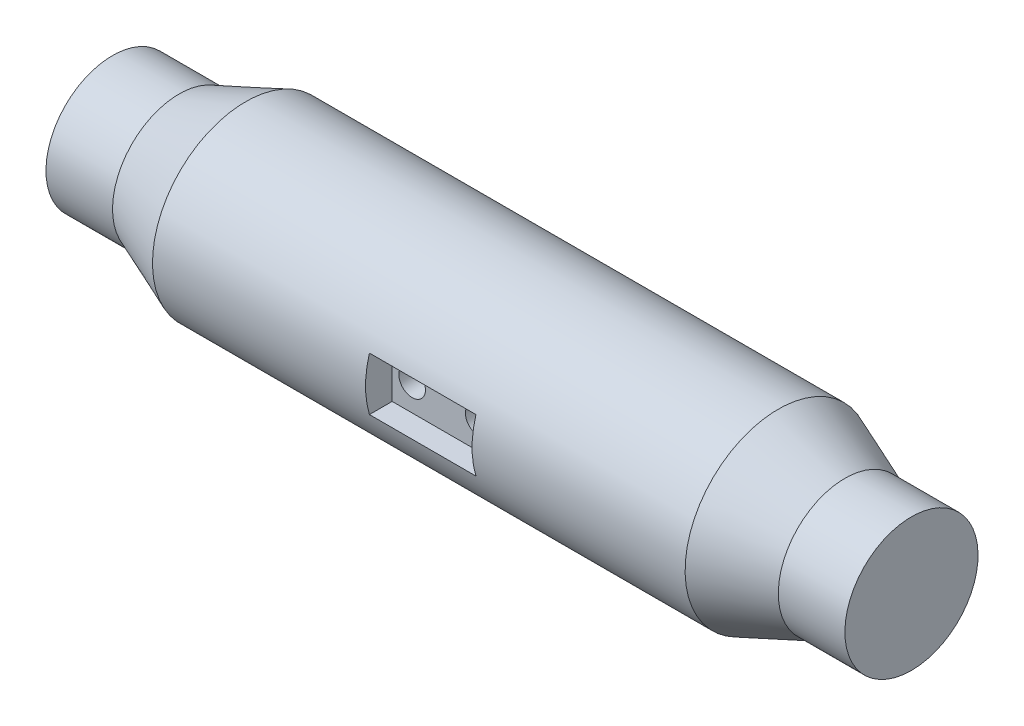
ISO-10303-21;
HEADER;
FILE_DESCRIPTION(('STEP AP214'),'2;1');
FILE_NAME('part.step','',(''),(''),'','','');
FILE_SCHEMA(('AUTOMOTIVE_DESIGN { 1 0 10303 214 1 1 1 1 }'));
ENDSEC;
DATA;
#1=APPLICATION_CONTEXT('core data for automotive mechanical design processes');
#2=APPLICATION_PROTOCOL_DEFINITION('international standard','automotive_design',2000,#1);
#3=PRODUCT_CONTEXT('',#1,'mechanical');
#4=PRODUCT('Part','Part','',(#3));
#5=PRODUCT_RELATED_PRODUCT_CATEGORY('part','',(#4));
#6=PRODUCT_DEFINITION_FORMATION('','',#4);
#7=PRODUCT_DEFINITION_CONTEXT('part definition',#1,'design');
#8=PRODUCT_DEFINITION('design','',#6,#7);
#9=PRODUCT_DEFINITION_SHAPE('','',#8);
#10=(LENGTH_UNIT() NAMED_UNIT(*) SI_UNIT(.MILLI.,.METRE.));
#11=(NAMED_UNIT(*) PLANE_ANGLE_UNIT() SI_UNIT($,.RADIAN.));
#12=(NAMED_UNIT(*) SI_UNIT($,.STERADIAN.) SOLID_ANGLE_UNIT());
#13=UNCERTAINTY_MEASURE_WITH_UNIT(LENGTH_MEASURE(1.E-05),#10,'distance_accuracy_value','');
#14=(GEOMETRIC_REPRESENTATION_CONTEXT(3) GLOBAL_UNCERTAINTY_ASSIGNED_CONTEXT((#13)) GLOBAL_UNIT_ASSIGNED_CONTEXT((#10,
#11,#12)) REPRESENTATION_CONTEXT('',''));
#15=CARTESIAN_POINT('',(0.,0.,0.));
#16=DIRECTION('',(0.,0.,1.));
#17=DIRECTION('',(1.,0.,0.));
#18=AXIS2_PLACEMENT_3D('',#15,#16,#17);
#19=CARTESIAN_POINT('',(30.,0.,0.));
#20=DIRECTION('',(-1.,0.,0.));
#21=DIRECTION('',(0.,-1.,0.));
#22=AXIS2_PLACEMENT_3D('',#19,#20,#21);
#23=PLANE('',#22);
#24=CARTESIAN_POINT('',(30.,0.,0.));
#25=DIRECTION('',(-1.,0.,0.));
#26=DIRECTION('',(0.,-1.,0.));
#27=AXIS2_PLACEMENT_3D('',#24,#25,#26);
#28=CIRCLE('',#27,5.);
#29=CARTESIAN_POINT('',(30.,-5.,0.));
#30=VERTEX_POINT('',#29);
#31=EDGE_CURVE('E124',#30,#30,#28,.T.);
#32=ORIENTED_EDGE('',*,*,#31,.F.);
#33=EDGE_LOOP('',(#32));
#34=FACE_BOUND('',#33,.T.);
#35=ADVANCED_FACE('F33',(#34),#23,.F.);
#36=CARTESIAN_POINT('',(-30.,0.,0.));
#37=DIRECTION('',(-1.,0.,0.));
#38=DIRECTION('',(0.,-1.,0.));
#39=AXIS2_PLACEMENT_3D('',#36,#37,#38);
#40=CYLINDRICAL_SURFACE('',#39,5.);
#41=CARTESIAN_POINT('',(25.,0.,0.));
#42=DIRECTION('',(-1.,0.,0.));
#43=DIRECTION('',(0.,-1.,0.));
#44=AXIS2_PLACEMENT_3D('',#41,#42,#43);
#45=CIRCLE('',#44,5.);
#46=CARTESIAN_POINT('',(25.,-5.,0.));
#47=VERTEX_POINT('',#46);
#48=EDGE_CURVE('E121',#47,#47,#45,.T.);
#49=ORIENTED_EDGE('',*,*,#48,.F.);
#50=EDGE_LOOP('',(#49));
#51=FACE_BOUND('',#50,.T.);
#52=ORIENTED_EDGE('',*,*,#31,.T.);
#53=EDGE_LOOP('',(#52));
#54=FACE_BOUND('',#53,.T.);
#55=ADVANCED_FACE('F146',(#51,#54),#40,.T.);
#56=CARTESIAN_POINT('',(25.,0.,0.));
#57=DIRECTION('',(-1.,0.,0.));
#58=DIRECTION('',(0.,-1.,0.));
#59=AXIS2_PLACEMENT_3D('',#56,#57,#58);
#60=CONICAL_SURFACE('',#59,5.,0.380506377112366);
#61=CARTESIAN_POINT('',(20.,0.,0.));
#62=DIRECTION('',(-1.,0.,0.));
#63=DIRECTION('',(0.,-1.,0.));
#64=AXIS2_PLACEMENT_3D('',#61,#62,#63);
#65=CIRCLE('',#64,7.);
#66=CARTESIAN_POINT('',(20.,-7.,0.));
#67=VERTEX_POINT('',#66);
#68=EDGE_CURVE('E118',#67,#67,#65,.T.);
#69=ORIENTED_EDGE('',*,*,#68,.F.);
#70=EDGE_LOOP('',(#69));
#71=FACE_BOUND('',#70,.T.);
#72=ORIENTED_EDGE('',*,*,#48,.T.);
#73=EDGE_LOOP('',(#72));
#74=FACE_BOUND('',#73,.T.);
#75=ADVANCED_FACE('F151',(#71,#74),#60,.T.);
#76=CARTESIAN_POINT('',(-30.,0.,0.));
#77=DIRECTION('',(-1.,0.,0.));
#78=DIRECTION('',(0.,-1.,0.));
#79=AXIS2_PLACEMENT_3D('',#76,#77,#78);
#80=CYLINDRICAL_SURFACE('',#79,7.);
#81=CARTESIAN_POINT('',(-4.,0.,0.));
#82=DIRECTION('',(-1.,0.,0.));
#83=DIRECTION('',(0.,0.,1.));
#84=AXIS2_PLACEMENT_3D('',#81,#82,#83);
#85=CIRCLE('',#84,7.);
#86=CARTESIAN_POINT('',(-4.,-2.,6.70820393249937));
#87=VERTEX_POINT('',#86);
#88=CARTESIAN_POINT('',(-4.,2.,6.70820393249937));
#89=VERTEX_POINT('',#88);
#90=EDGE_CURVE('E127',#87,#89,#85,.T.);
#91=ORIENTED_EDGE('',*,*,#90,.T.);
#92=DIRECTION('',(-1.,0.,0.));
#93=VECTOR('',#92,1.);
#94=CARTESIAN_POINT('',(-30.,2.,6.70820393249937));
#95=LINE('',#94,#93);
#96=CARTESIAN_POINT('',(4.,2.,6.70820393249937));
#97=VERTEX_POINT('',#96);
#98=EDGE_CURVE('E11',#89,#97,#95,.F.);
#99=ORIENTED_EDGE('',*,*,#98,.T.);
#100=CARTESIAN_POINT('',(4.,0.,0.));
#101=DIRECTION('',(1.,0.,0.));
#102=DIRECTION('',(0.,0.,-1.));
#103=AXIS2_PLACEMENT_3D('',#100,#101,#102);
#104=CIRCLE('',#103,7.);
#105=CARTESIAN_POINT('',(4.,-2.,6.70820393249937));
#106=VERTEX_POINT('',#105);
#107=EDGE_CURVE('E40',#97,#106,#104,.T.);
#108=ORIENTED_EDGE('',*,*,#107,.T.);
#109=DIRECTION('',(-1.,0.,0.));
#110=VECTOR('',#109,1.);
#111=CARTESIAN_POINT('',(-30.,-2.,6.70820393249937));
#112=LINE('',#111,#110);
#113=EDGE_CURVE('E54',#106,#87,#112,.T.);
#114=ORIENTED_EDGE('',*,*,#113,.T.);
#115=EDGE_LOOP('',(#91,#99,#108,#114));
#116=FACE_BOUND('',#115,.T.);
#117=CARTESIAN_POINT('',(-20.,0.,0.));
#118=DIRECTION('',(-1.,0.,0.));
#119=DIRECTION('',(0.,-1.,0.));
#120=AXIS2_PLACEMENT_3D('',#117,#118,#119);
#121=CIRCLE('',#120,7.);
#122=CARTESIAN_POINT('',(-20.,-7.,0.));
#123=VERTEX_POINT('',#122);
#124=EDGE_CURVE('E115',#123,#123,#121,.T.);
#125=ORIENTED_EDGE('',*,*,#124,.F.);
#126=EDGE_LOOP('',(#125));
#127=FACE_BOUND('',#126,.T.);
#128=ORIENTED_EDGE('',*,*,#68,.T.);
#129=EDGE_LOOP('',(#128));
#130=FACE_BOUND('',#129,.T.);
#131=ADVANCED_FACE('F130',(#116,#127,#130),#80,.T.);
#132=CARTESIAN_POINT('',(-20.,0.,0.));
#133=DIRECTION('',(1.,0.,0.));
#134=DIRECTION('',(0.,1.,0.));
#135=AXIS2_PLACEMENT_3D('',#132,#133,#134);
#136=CONICAL_SURFACE('',#135,7.,0.380506377112366);
#137=CARTESIAN_POINT('',(-25.,0.,0.));
#138=DIRECTION('',(-1.,0.,0.));
#139=DIRECTION('',(0.,-1.,0.));
#140=AXIS2_PLACEMENT_3D('',#137,#138,#139);
#141=CIRCLE('',#140,5.);
#142=CARTESIAN_POINT('',(-25.,-5.,0.));
#143=VERTEX_POINT('',#142);
#144=EDGE_CURVE('E112',#143,#143,#141,.T.);
#145=ORIENTED_EDGE('',*,*,#144,.F.);
#146=EDGE_LOOP('',(#145));
#147=FACE_BOUND('',#146,.T.);
#148=ORIENTED_EDGE('',*,*,#124,.T.);
#149=EDGE_LOOP('',(#148));
#150=FACE_BOUND('',#149,.T.);
#151=ADVANCED_FACE('F164',(#147,#150),#136,.T.);
#152=CARTESIAN_POINT('',(-30.,0.,0.));
#153=DIRECTION('',(-1.,0.,0.));
#154=DIRECTION('',(0.,-1.,0.));
#155=AXIS2_PLACEMENT_3D('',#152,#153,#154);
#156=CYLINDRICAL_SURFACE('',#155,5.);
#157=CARTESIAN_POINT('',(-30.,0.,0.));
#158=DIRECTION('',(-1.,0.,0.));
#159=DIRECTION('',(0.,-1.,0.));
#160=AXIS2_PLACEMENT_3D('',#157,#158,#159);
#161=CIRCLE('',#160,5.);
#162=CARTESIAN_POINT('',(-30.,-5.,0.));
#163=VERTEX_POINT('',#162);
#164=EDGE_CURVE('E106',#163,#163,#161,.T.);
#165=ORIENTED_EDGE('',*,*,#164,.F.);
#166=EDGE_LOOP('',(#165));
#167=FACE_BOUND('',#166,.T.);
#168=ORIENTED_EDGE('',*,*,#144,.T.);
#169=EDGE_LOOP('',(#168));
#170=FACE_BOUND('',#169,.T.);
#171=ADVANCED_FACE('F167',(#167,#170),#156,.T.);
#172=CARTESIAN_POINT('',(-30.,0.,0.));
#173=DIRECTION('',(1.,0.,0.));
#174=DIRECTION('',(0.,1.,0.));
#175=AXIS2_PLACEMENT_3D('',#172,#173,#174);
#176=PLANE('',#175);
#177=ORIENTED_EDGE('',*,*,#164,.T.);
#178=EDGE_LOOP('',(#177));
#179=FACE_BOUND('',#178,.T.);
#180=ADVANCED_FACE('F142',(#179),#176,.F.);
#181=CARTESIAN_POINT('',(4.,-2.,5.));
#182=DIRECTION('',(1.,0.,0.));
#183=DIRECTION('',(0.,0.,-1.));
#184=AXIS2_PLACEMENT_3D('',#181,#182,#183);
#185=PLANE('',#184);
#186=DIRECTION('',(0.,0.,1.));
#187=VECTOR('',#186,1.);
#188=CARTESIAN_POINT('',(4.,2.,5.));
#189=LINE('',#188,#187);
#190=CARTESIAN_POINT('',(4.,2.,5.));
#191=VERTEX_POINT('',#190);
#192=EDGE_CURVE('E71',#191,#97,#189,.T.);
#193=ORIENTED_EDGE('',*,*,#192,.F.);
#194=DIRECTION('',(0.,1.,0.));
#195=VECTOR('',#194,1.);
#196=CARTESIAN_POINT('',(4.,-2.,5.));
#197=LINE('',#196,#195);
#198=CARTESIAN_POINT('',(4.,-2.,5.));
#199=VERTEX_POINT('',#198);
#200=EDGE_CURVE('E75',#199,#191,#197,.T.);
#201=ORIENTED_EDGE('',*,*,#200,.F.);
#202=DIRECTION('',(0.,0.,1.));
#203=VECTOR('',#202,1.);
#204=CARTESIAN_POINT('',(4.,-2.,5.));
#205=LINE('',#204,#203);
#206=EDGE_CURVE('E104',#199,#106,#205,.T.);
#207=ORIENTED_EDGE('',*,*,#206,.T.);
#208=ORIENTED_EDGE('',*,*,#107,.F.);
#209=EDGE_LOOP('',(#193,#201,#207,#208));
#210=FACE_BOUND('',#209,.T.);
#211=ADVANCED_FACE('F73',(#210),#185,.F.);
#212=CARTESIAN_POINT('',(-4.,-2.,5.));
#213=DIRECTION('',(0.,-1.,0.));
#214=DIRECTION('',(0.,0.,-1.));
#215=AXIS2_PLACEMENT_3D('',#212,#213,#214);
#216=PLANE('',#215);
#217=ORIENTED_EDGE('',*,*,#206,.F.);
#218=DIRECTION('',(1.,0.,0.));
#219=VECTOR('',#218,1.);
#220=CARTESIAN_POINT('',(-4.,-2.,5.));
#221=LINE('',#220,#219);
#222=CARTESIAN_POINT('',(-4.,-2.,5.));
#223=VERTEX_POINT('',#222);
#224=EDGE_CURVE('E80',#223,#199,#221,.T.);
#225=ORIENTED_EDGE('',*,*,#224,.F.);
#226=DIRECTION('',(0.,0.,1.));
#227=VECTOR('',#226,1.);
#228=CARTESIAN_POINT('',(-4.,-2.,5.));
#229=LINE('',#228,#227);
#230=EDGE_CURVE('E107',#223,#87,#229,.T.);
#231=ORIENTED_EDGE('',*,*,#230,.T.);
#232=ORIENTED_EDGE('',*,*,#113,.F.);
#233=EDGE_LOOP('',(#217,#225,#231,#232));
#234=FACE_BOUND('',#233,.T.);
#235=ADVANCED_FACE('F134',(#234),#216,.F.);
#236=CARTESIAN_POINT('',(-4.,-2.,5.));
#237=DIRECTION('',(-1.,0.,0.));
#238=DIRECTION('',(0.,0.,1.));
#239=AXIS2_PLACEMENT_3D('',#236,#237,#238);
#240=PLANE('',#239);
#241=ORIENTED_EDGE('',*,*,#90,.F.);
#242=ORIENTED_EDGE('',*,*,#230,.F.);
#243=DIRECTION('',(0.,-1.,0.));
#244=VECTOR('',#243,1.);
#245=CARTESIAN_POINT('',(-4.,-2.,5.));
#246=LINE('',#245,#244);
#247=CARTESIAN_POINT('',(-4.,2.,5.));
#248=VERTEX_POINT('',#247);
#249=EDGE_CURVE('E89',#248,#223,#246,.T.);
#250=ORIENTED_EDGE('',*,*,#249,.F.);
#251=DIRECTION('',(0.,0.,1.));
#252=VECTOR('',#251,1.);
#253=CARTESIAN_POINT('',(-4.,2.,5.));
#254=LINE('',#253,#252);
#255=EDGE_CURVE('E79',#248,#89,#254,.T.);
#256=ORIENTED_EDGE('',*,*,#255,.T.);
#257=EDGE_LOOP('',(#241,#242,#250,#256));
#258=FACE_BOUND('',#257,.T.);
#259=ADVANCED_FACE('F133',(#258),#240,.F.);
#260=CARTESIAN_POINT('',(-4.,2.,5.));
#261=DIRECTION('',(0.,1.,0.));
#262=DIRECTION('',(0.,0.,1.));
#263=AXIS2_PLACEMENT_3D('',#260,#261,#262);
#264=PLANE('',#263);
#265=ORIENTED_EDGE('',*,*,#255,.F.);
#266=DIRECTION('',(-1.,0.,0.));
#267=VECTOR('',#266,1.);
#268=CARTESIAN_POINT('',(-4.,2.,5.));
#269=LINE('',#268,#267);
#270=EDGE_CURVE('E83',#191,#248,#269,.T.);
#271=ORIENTED_EDGE('',*,*,#270,.F.);
#272=ORIENTED_EDGE('',*,*,#192,.T.);
#273=ORIENTED_EDGE('',*,*,#98,.F.);
#274=EDGE_LOOP('',(#265,#271,#272,#273));
#275=FACE_BOUND('',#274,.T.);
#276=ADVANCED_FACE('F84',(#275),#264,.F.);
#277=CARTESIAN_POINT('',(0.,0.,5.));
#278=DIRECTION('',(0.,0.,-1.));
#279=DIRECTION('',(-1.,0.,0.));
#280=AXIS2_PLACEMENT_3D('',#277,#278,#279);
#281=PLANE('',#280);
#282=CARTESIAN_POINT('',(2.5,0.,5.));
#283=DIRECTION('',(0.,0.,1.));
#284=DIRECTION('',(1.,0.,0.));
#285=AXIS2_PLACEMENT_3D('',#282,#283,#284);
#286=CIRCLE('',#285,1.);
#287=CARTESIAN_POINT('',(3.5,0.,5.));
#288=VERTEX_POINT('',#287);
#289=EDGE_CURVE('E96',#288,#288,#286,.T.);
#290=ORIENTED_EDGE('',*,*,#289,.F.);
#291=EDGE_LOOP('',(#290));
#292=FACE_BOUND('',#291,.T.);
#293=CARTESIAN_POINT('',(-2.5,0.,5.));
#294=DIRECTION('',(0.,0.,1.));
#295=DIRECTION('',(1.,0.,0.));
#296=AXIS2_PLACEMENT_3D('',#293,#294,#295);
#297=CIRCLE('',#296,1.);
#298=CARTESIAN_POINT('',(-1.5,0.,5.));
#299=VERTEX_POINT('',#298);
#300=EDGE_CURVE('E99',#299,#299,#297,.T.);
#301=ORIENTED_EDGE('',*,*,#300,.F.);
#302=EDGE_LOOP('',(#301));
#303=FACE_BOUND('',#302,.T.);
#304=ORIENTED_EDGE('',*,*,#200,.T.);
#305=ORIENTED_EDGE('',*,*,#270,.T.);
#306=ORIENTED_EDGE('',*,*,#249,.T.);
#307=ORIENTED_EDGE('',*,*,#224,.T.);
#308=EDGE_LOOP('',(#304,#305,#306,#307));
#309=FACE_BOUND('',#308,.T.);
#310=ADVANCED_FACE('F91',(#292,#303,#309),#281,.F.);
#311=CARTESIAN_POINT('',(-2.5,0.,-5.));
#312=DIRECTION('',(0.,0.,1.));
#313=DIRECTION('',(1.,0.,0.));
#314=AXIS2_PLACEMENT_3D('',#311,#312,#313);
#315=CYLINDRICAL_SURFACE('',#314,1.);
#316=CARTESIAN_POINT('',(-2.5,0.,-5.));
#317=DIRECTION('',(0.,0.,1.));
#318=DIRECTION('',(1.,0.,0.));
#319=AXIS2_PLACEMENT_3D('',#316,#317,#318);
#320=CIRCLE('',#319,1.);
#321=CARTESIAN_POINT('',(-1.5,0.,-5.));
#322=VERTEX_POINT('',#321);
#323=EDGE_CURVE('E205',#322,#322,#320,.T.);
#324=ORIENTED_EDGE('',*,*,#323,.F.);
#325=EDGE_LOOP('',(#324));
#326=FACE_BOUND('',#325,.T.);
#327=ORIENTED_EDGE('',*,*,#300,.T.);
#328=EDGE_LOOP('',(#327));
#329=FACE_BOUND('',#328,.T.);
#330=ADVANCED_FACE('F179',(#326,#329),#315,.F.);
#331=CARTESIAN_POINT('',(-2.5,0.,-5.));
#332=DIRECTION('',(0.,0.,1.));
#333=DIRECTION('',(1.,0.,0.));
#334=AXIS2_PLACEMENT_3D('',#331,#332,#333);
#335=PLANE('',#334);
#336=ORIENTED_EDGE('',*,*,#323,.T.);
#337=EDGE_LOOP('',(#336));
#338=FACE_BOUND('',#337,.T.);
#339=ADVANCED_FACE('F184',(#338),#335,.T.);
#340=CARTESIAN_POINT('',(2.5,0.,-5.));
#341=DIRECTION('',(0.,0.,1.));
#342=DIRECTION('',(1.,0.,0.));
#343=AXIS2_PLACEMENT_3D('',#340,#341,#342);
#344=CYLINDRICAL_SURFACE('',#343,1.);
#345=CARTESIAN_POINT('',(2.5,0.,-5.));
#346=DIRECTION('',(0.,0.,1.));
#347=DIRECTION('',(1.,0.,0.));
#348=AXIS2_PLACEMENT_3D('',#345,#346,#347);
#349=CIRCLE('',#348,1.);
#350=CARTESIAN_POINT('',(3.5,0.,-5.));
#351=VERTEX_POINT('',#350);
#352=EDGE_CURVE('E93',#351,#351,#349,.T.);
#353=ORIENTED_EDGE('',*,*,#352,.F.);
#354=EDGE_LOOP('',(#353));
#355=FACE_BOUND('',#354,.T.);
#356=ORIENTED_EDGE('',*,*,#289,.T.);
#357=EDGE_LOOP('',(#356));
#358=FACE_BOUND('',#357,.T.);
#359=ADVANCED_FACE('F192',(#355,#358),#344,.F.);
#360=CARTESIAN_POINT('',(2.5,0.,-5.));
#361=DIRECTION('',(0.,0.,1.));
#362=DIRECTION('',(1.,0.,0.));
#363=AXIS2_PLACEMENT_3D('',#360,#361,#362);
#364=PLANE('',#363);
#365=ORIENTED_EDGE('',*,*,#352,.T.);
#366=EDGE_LOOP('',(#365));
#367=FACE_BOUND('',#366,.T.);
#368=ADVANCED_FACE('F196',(#367),#364,.T.);
#369=CLOSED_SHELL('',(#35,#55,#75,#131,#151,#171,#180,#211,#235,#259,#276,#310,#330,#339,#359,#368));
#370=MANIFOLD_SOLID_BREP('B2',#369);
#371=ADVANCED_BREP_SHAPE_REPRESENTATION('',(#18,#370),#14);
#372=SHAPE_DEFINITION_REPRESENTATION(#9,#371);
ENDSEC;
END-ISO-10303-21;
